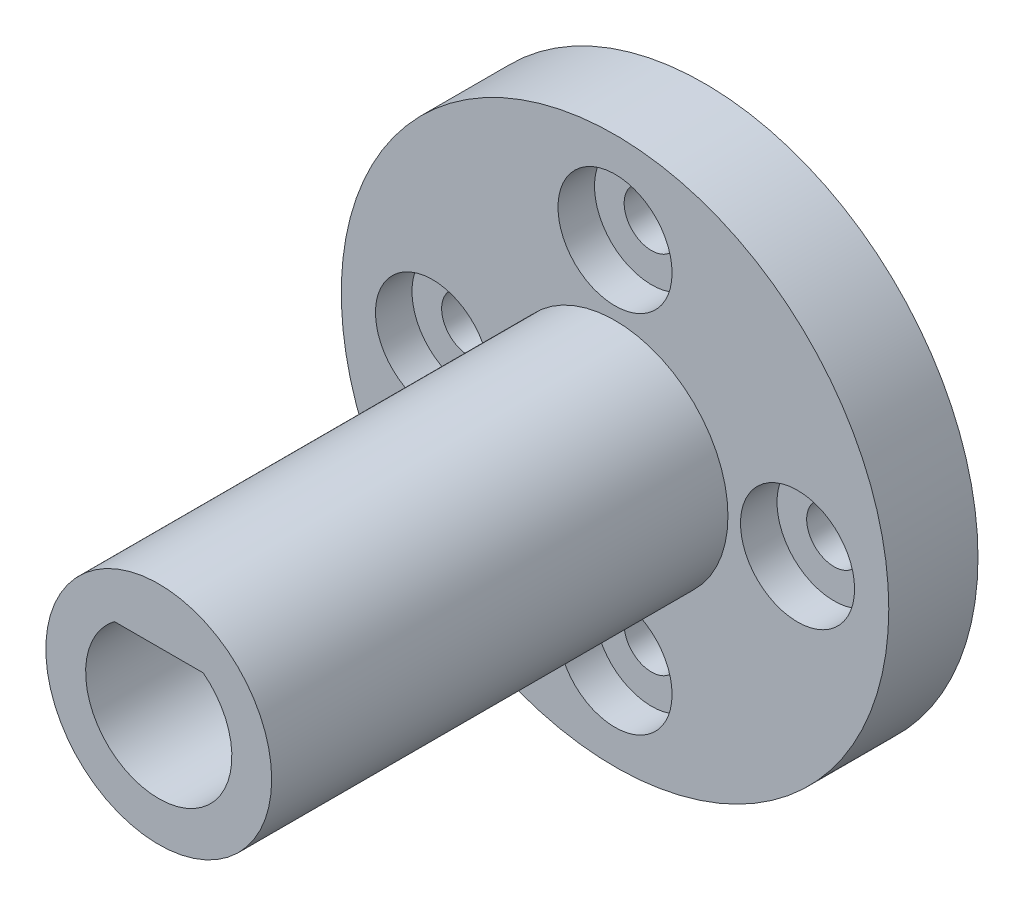
ISO-10303-21;
HEADER;
FILE_DESCRIPTION(('STEP AP214'),'2;1');
FILE_NAME('part.step','',(''),(''),'','','');
FILE_SCHEMA(('AUTOMOTIVE_DESIGN { 1 0 10303 214 1 1 1 1 }'));
ENDSEC;
DATA;
#1=APPLICATION_CONTEXT('core data for automotive mechanical design processes');
#2=APPLICATION_PROTOCOL_DEFINITION('international standard','automotive_design',2000,#1);
#3=PRODUCT_CONTEXT('',#1,'mechanical');
#4=PRODUCT('Part','Part','',(#3));
#5=PRODUCT_RELATED_PRODUCT_CATEGORY('part','',(#4));
#6=PRODUCT_DEFINITION_FORMATION('','',#4);
#7=PRODUCT_DEFINITION_CONTEXT('part definition',#1,'design');
#8=PRODUCT_DEFINITION('design','',#6,#7);
#9=PRODUCT_DEFINITION_SHAPE('','',#8);
#10=(LENGTH_UNIT() NAMED_UNIT(*) SI_UNIT(.MILLI.,.METRE.));
#11=(NAMED_UNIT(*) PLANE_ANGLE_UNIT() SI_UNIT($,.RADIAN.));
#12=(NAMED_UNIT(*) SI_UNIT($,.STERADIAN.) SOLID_ANGLE_UNIT());
#13=UNCERTAINTY_MEASURE_WITH_UNIT(LENGTH_MEASURE(1.E-05),#10,'distance_accuracy_value','');
#14=(GEOMETRIC_REPRESENTATION_CONTEXT(3) GLOBAL_UNCERTAINTY_ASSIGNED_CONTEXT((#13)) GLOBAL_UNIT_ASSIGNED_CONTEXT((#10,
#11,#12)) REPRESENTATION_CONTEXT('',''));
#15=CARTESIAN_POINT('',(0.,0.,0.));
#16=DIRECTION('',(0.,0.,1.));
#17=DIRECTION('',(1.,0.,0.));
#18=AXIS2_PLACEMENT_3D('',#15,#16,#17);
#19=CARTESIAN_POINT('',(0.,0.,3.91));
#20=DIRECTION('',(0.,0.,-1.));
#21=DIRECTION('',(-1.,0.,0.));
#22=AXIS2_PLACEMENT_3D('',#19,#20,#21);
#23=CYLINDRICAL_SURFACE('',#22,12.);
#24=CARTESIAN_POINT('',(0.,0.,3.91));
#25=DIRECTION('',(0.,0.,1.));
#26=DIRECTION('',(1.,0.,0.));
#27=AXIS2_PLACEMENT_3D('',#24,#25,#26);
#28=CIRCLE('',#27,12.);
#29=CARTESIAN_POINT('',(12.,0.,3.91));
#30=VERTEX_POINT('',#29);
#31=EDGE_CURVE('E11',#30,#30,#28,.T.);
#32=ORIENTED_EDGE('',*,*,#31,.F.);
#33=EDGE_LOOP('',(#32));
#34=FACE_BOUND('',#33,.T.);
#35=CARTESIAN_POINT('',(0.,0.,0.));
#36=DIRECTION('',(0.,0.,1.));
#37=DIRECTION('',(1.,0.,0.));
#38=AXIS2_PLACEMENT_3D('',#35,#36,#37);
#39=CIRCLE('',#38,12.);
#40=CARTESIAN_POINT('',(12.,0.,0.));
#41=VERTEX_POINT('',#40);
#42=EDGE_CURVE('E40',#41,#41,#39,.T.);
#43=ORIENTED_EDGE('',*,*,#42,.T.);
#44=EDGE_LOOP('',(#43));
#45=FACE_BOUND('',#44,.T.);
#46=ADVANCED_FACE('F37',(#34,#45),#23,.T.);
#47=CARTESIAN_POINT('',(0.,0.,3.91));
#48=DIRECTION('',(0.,0.,1.));
#49=DIRECTION('',(1.,0.,0.));
#50=AXIS2_PLACEMENT_3D('',#47,#48,#49);
#51=PLANE('',#50);
#52=CARTESIAN_POINT('',(8.,0.,3.91));
#53=DIRECTION('',(0.,0.,1.));
#54=DIRECTION('',(1.,0.,0.));
#55=AXIS2_PLACEMENT_3D('',#52,#53,#54);
#56=CIRCLE('',#55,2.5);
#57=CARTESIAN_POINT('',(10.5,0.,3.91));
#58=VERTEX_POINT('',#57);
#59=EDGE_CURVE('E307',#58,#58,#56,.T.);
#60=ORIENTED_EDGE('',*,*,#59,.F.);
#61=EDGE_LOOP('',(#60));
#62=FACE_BOUND('',#61,.T.);
#63=CARTESIAN_POINT('',(0.,-8.,3.91));
#64=DIRECTION('',(0.,0.,1.));
#65=DIRECTION('',(1.,0.,0.));
#66=AXIS2_PLACEMENT_3D('',#63,#64,#65);
#67=CIRCLE('',#66,2.5);
#68=CARTESIAN_POINT('',(2.5,-8.,3.91));
#69=VERTEX_POINT('',#68);
#70=EDGE_CURVE('E317',#69,#69,#67,.T.);
#71=ORIENTED_EDGE('',*,*,#70,.F.);
#72=EDGE_LOOP('',(#71));
#73=FACE_BOUND('',#72,.T.);
#74=CARTESIAN_POINT('',(-8.,0.,3.91));
#75=DIRECTION('',(0.,0.,1.));
#76=DIRECTION('',(1.,0.,0.));
#77=AXIS2_PLACEMENT_3D('',#74,#75,#76);
#78=CIRCLE('',#77,2.5);
#79=CARTESIAN_POINT('',(-5.50000000000001,0.,3.91));
#80=VERTEX_POINT('',#79);
#81=EDGE_CURVE('E329',#80,#80,#78,.T.);
#82=ORIENTED_EDGE('',*,*,#81,.F.);
#83=EDGE_LOOP('',(#82));
#84=FACE_BOUND('',#83,.T.);
#85=CARTESIAN_POINT('',(0.,8.,3.91));
#86=DIRECTION('',(0.,0.,1.));
#87=DIRECTION('',(1.,0.,0.));
#88=AXIS2_PLACEMENT_3D('',#85,#86,#87);
#89=CIRCLE('',#88,2.5);
#90=CARTESIAN_POINT('',(2.5,8.,3.91));
#91=VERTEX_POINT('',#90);
#92=EDGE_CURVE('E341',#91,#91,#89,.T.);
#93=ORIENTED_EDGE('',*,*,#92,.F.);
#94=EDGE_LOOP('',(#93));
#95=FACE_BOUND('',#94,.T.);
#96=CARTESIAN_POINT('',(0.,0.,3.91));
#97=DIRECTION('',(0.,0.,1.));
#98=DIRECTION('',(1.,0.,0.));
#99=AXIS2_PLACEMENT_3D('',#96,#97,#98);
#100=CIRCLE('',#99,4.95);
#101=CARTESIAN_POINT('',(4.95,0.,3.91));
#102=VERTEX_POINT('',#101);
#103=EDGE_CURVE('E77',#102,#102,#100,.T.);
#104=ORIENTED_EDGE('',*,*,#103,.F.);
#105=EDGE_LOOP('',(#104));
#106=FACE_BOUND('',#105,.T.);
#107=ORIENTED_EDGE('',*,*,#31,.T.);
#108=EDGE_LOOP('',(#107));
#109=FACE_BOUND('',#108,.T.);
#110=ADVANCED_FACE('F96',(#62,#73,#84,#95,#106,#109),#51,.T.);
#111=CARTESIAN_POINT('',(0.,0.,0.));
#112=DIRECTION('',(0.,0.,1.));
#113=DIRECTION('',(1.,0.,0.));
#114=AXIS2_PLACEMENT_3D('',#111,#112,#113);
#115=PLANE('',#114);
#116=CARTESIAN_POINT('',(8.,0.,0.));
#117=DIRECTION('',(0.,0.,1.));
#118=DIRECTION('',(1.,0.,0.));
#119=AXIS2_PLACEMENT_3D('',#116,#117,#118);
#120=CIRCLE('',#119,1.2);
#121=CARTESIAN_POINT('',(9.2,0.,0.));
#122=VERTEX_POINT('',#121);
#123=EDGE_CURVE('E314',#122,#122,#120,.T.);
#124=ORIENTED_EDGE('',*,*,#123,.T.);
#125=EDGE_LOOP('',(#124));
#126=FACE_BOUND('',#125,.T.);
#127=CARTESIAN_POINT('',(0.,-8.,0.));
#128=DIRECTION('',(0.,0.,1.));
#129=DIRECTION('',(1.,0.,0.));
#130=AXIS2_PLACEMENT_3D('',#127,#128,#129);
#131=CIRCLE('',#130,1.2);
#132=CARTESIAN_POINT('',(1.2,-8.,0.));
#133=VERTEX_POINT('',#132);
#134=EDGE_CURVE('E326',#133,#133,#131,.T.);
#135=ORIENTED_EDGE('',*,*,#134,.T.);
#136=EDGE_LOOP('',(#135));
#137=FACE_BOUND('',#136,.T.);
#138=CARTESIAN_POINT('',(-8.,0.,0.));
#139=DIRECTION('',(0.,0.,1.));
#140=DIRECTION('',(1.,0.,0.));
#141=AXIS2_PLACEMENT_3D('',#138,#139,#140);
#142=CIRCLE('',#141,1.2);
#143=CARTESIAN_POINT('',(-6.8,0.,0.));
#144=VERTEX_POINT('',#143);
#145=EDGE_CURVE('E338',#144,#144,#142,.T.);
#146=ORIENTED_EDGE('',*,*,#145,.T.);
#147=EDGE_LOOP('',(#146));
#148=FACE_BOUND('',#147,.T.);
#149=CARTESIAN_POINT('',(0.,8.,0.));
#150=DIRECTION('',(0.,0.,1.));
#151=DIRECTION('',(1.,0.,0.));
#152=AXIS2_PLACEMENT_3D('',#149,#150,#151);
#153=CIRCLE('',#152,1.2);
#154=CARTESIAN_POINT('',(1.2,8.,0.));
#155=VERTEX_POINT('',#154);
#156=EDGE_CURVE('E67',#155,#155,#153,.T.);
#157=ORIENTED_EDGE('',*,*,#156,.T.);
#158=EDGE_LOOP('',(#157));
#159=FACE_BOUND('',#158,.T.);
#160=CARTESIAN_POINT('',(0.,0.,0.));
#161=DIRECTION('',(0.,0.,-1.));
#162=DIRECTION('',(-1.,0.,0.));
#163=AXIS2_PLACEMENT_3D('',#160,#161,#162);
#164=CIRCLE('',#163,4.);
#165=CARTESIAN_POINT('',(-4.,0.,0.));
#166=VERTEX_POINT('',#165);
#167=EDGE_CURVE('E84',#166,#166,#164,.T.);
#168=ORIENTED_EDGE('',*,*,#167,.F.);
#169=EDGE_LOOP('',(#168));
#170=FACE_BOUND('',#169,.T.);
#171=ORIENTED_EDGE('',*,*,#42,.F.);
#172=EDGE_LOOP('',(#171));
#173=FACE_BOUND('',#172,.T.);
#174=ADVANCED_FACE('F93',(#126,#137,#148,#159,#170,#173),#115,.F.);
#175=CARTESIAN_POINT('',(0.,0.,1.91));
#176=DIRECTION('',(0.,0.,-1.));
#177=DIRECTION('',(-1.,0.,0.));
#178=AXIS2_PLACEMENT_3D('',#175,#176,#177);
#179=CYLINDRICAL_SURFACE('',#178,4.);
#180=CARTESIAN_POINT('',(0.,0.,1.91));
#181=DIRECTION('',(0.,0.,-1.));
#182=DIRECTION('',(-1.,0.,0.));
#183=AXIS2_PLACEMENT_3D('',#180,#181,#182);
#184=CIRCLE('',#183,4.);
#185=CARTESIAN_POINT('',(-4.,0.,1.91));
#186=VERTEX_POINT('',#185);
#187=EDGE_CURVE('E85',#186,#186,#184,.T.);
#188=CARTESIAN_POINT('',(-4.,0.,1.91));
#189=CARTESIAN_POINT('',(-4.,0.,1.89010416666667));
#190=CARTESIAN_POINT('',(-4.,0.,1.87020833333333));
#191=CARTESIAN_POINT('',(-4.,0.,1.83041666666667));
#192=CARTESIAN_POINT('',(-4.,0.,1.81052083333333));
#193=CARTESIAN_POINT('',(-4.,0.,1.77072916666667));
#194=CARTESIAN_POINT('',(-4.,0.,1.75083333333333));
#195=CARTESIAN_POINT('',(-4.,0.,1.71104166666667));
#196=CARTESIAN_POINT('',(-4.,0.,1.69114583333333));
#197=CARTESIAN_POINT('',(-4.,0.,1.65135416666667));
#198=CARTESIAN_POINT('',(-4.,0.,1.63145833333333));
#199=CARTESIAN_POINT('',(-4.,0.,1.59166666666667));
#200=CARTESIAN_POINT('',(-4.,0.,1.57177083333333));
#201=CARTESIAN_POINT('',(-4.,0.,1.53197916666667));
#202=CARTESIAN_POINT('',(-4.,0.,1.51208333333333));
#203=CARTESIAN_POINT('',(-4.,0.,1.47229166666667));
#204=CARTESIAN_POINT('',(-4.,0.,1.45239583333333));
#205=CARTESIAN_POINT('',(-4.,0.,1.41260416666667));
#206=CARTESIAN_POINT('',(-4.,0.,1.39270833333333));
#207=CARTESIAN_POINT('',(-4.,0.,1.35291666666667));
#208=CARTESIAN_POINT('',(-4.,0.,1.33302083333333));
#209=CARTESIAN_POINT('',(-4.,0.,1.29322916666667));
#210=CARTESIAN_POINT('',(-4.,0.,1.27333333333333));
#211=CARTESIAN_POINT('',(-4.,0.,1.23354166666667));
#212=CARTESIAN_POINT('',(-4.,0.,1.21364583333333));
#213=CARTESIAN_POINT('',(-4.,0.,1.17385416666667));
#214=CARTESIAN_POINT('',(-4.,0.,1.15395833333333));
#215=CARTESIAN_POINT('',(-4.,0.,1.11416666666667));
#216=CARTESIAN_POINT('',(-4.,0.,1.09427083333333));
#217=CARTESIAN_POINT('',(-4.,0.,1.05447916666667));
#218=CARTESIAN_POINT('',(-4.,0.,1.03458333333333));
#219=CARTESIAN_POINT('',(-4.,0.,0.994791666666667));
#220=CARTESIAN_POINT('',(-4.,0.,0.974895833333334));
#221=CARTESIAN_POINT('',(-4.,0.,0.935104166666667));
#222=CARTESIAN_POINT('',(-4.,0.,0.915208333333333));
#223=CARTESIAN_POINT('',(-4.,0.,0.875416666666667));
#224=CARTESIAN_POINT('',(-4.,0.,0.855520833333333));
#225=CARTESIAN_POINT('',(-4.,0.,0.815729166666667));
#226=CARTESIAN_POINT('',(-4.,0.,0.795833333333333));
#227=CARTESIAN_POINT('',(-4.,0.,0.756041666666667));
#228=CARTESIAN_POINT('',(-4.,0.,0.736145833333333));
#229=CARTESIAN_POINT('',(-4.,0.,0.696354166666667));
#230=CARTESIAN_POINT('',(-4.,0.,0.676458333333333));
#231=CARTESIAN_POINT('',(-4.,0.,0.636666666666667));
#232=CARTESIAN_POINT('',(-4.,0.,0.616770833333333));
#233=CARTESIAN_POINT('',(-4.,0.,0.576979166666667));
#234=CARTESIAN_POINT('',(-4.,0.,0.557083333333333));
#235=CARTESIAN_POINT('',(-4.,0.,0.517291666666667));
#236=CARTESIAN_POINT('',(-4.,0.,0.497395833333333));
#237=CARTESIAN_POINT('',(-4.,0.,0.457604166666667));
#238=CARTESIAN_POINT('',(-4.,0.,0.437708333333333));
#239=CARTESIAN_POINT('',(-4.,0.,0.397916666666667));
#240=CARTESIAN_POINT('',(-4.,0.,0.378020833333333));
#241=CARTESIAN_POINT('',(-4.,0.,0.338229166666667));
#242=CARTESIAN_POINT('',(-4.,0.,0.318333333333333));
#243=CARTESIAN_POINT('',(-4.,0.,0.278541666666667));
#244=CARTESIAN_POINT('',(-4.,0.,0.258645833333333));
#245=CARTESIAN_POINT('',(-4.,0.,0.218854166666667));
#246=CARTESIAN_POINT('',(-4.,0.,0.198958333333333));
#247=CARTESIAN_POINT('',(-4.,0.,0.159166666666667));
#248=CARTESIAN_POINT('',(-4.,0.,0.139270833333333));
#249=CARTESIAN_POINT('',(-4.,0.,0.0994791666666668));
#250=CARTESIAN_POINT('',(-4.,0.,0.0795833333333334));
#251=CARTESIAN_POINT('',(-4.,0.,0.0397916666666667));
#252=CARTESIAN_POINT('',(-4.,0.,0.0198958333333334));
#253=CARTESIAN_POINT('',(-4.,0.,0.));
#254=B_SPLINE_CURVE_WITH_KNOTS('',3,(#188,#189,#190,#191,#192,#193,#194,#195,#196,#197,#198,
#199,#200,#201,#202,#203,#204,#205,#206,#207,#208,#209,#210,#211,#212,#213,#214,#215,#216,#217,
#218,#219,#220,#221,#222,#223,#224,#225,#226,#227,#228,#229,#230,#231,#232,#233,#234,#235,#236,
#237,#238,#239,#240,#241,#242,#243,#244,#245,#246,#247,#248,#249,#250,#251,#252,#253),
.UNSPECIFIED.,.F.,.F.,(4,2,2,2,2,2,2,2,2,2,2,2,2,2,2,2,2,2,2,2,2,2,2,2,2,2,2,2,2,2,2,2,4),(0.,
0.0596874999999998,0.119375,0.1790625,0.23875,0.2984375,0.358125,0.4178125,0.4775,0.5371875,
0.596875,0.6565625,0.71625,0.7759375,0.835625,0.8953125,0.955,1.0146875,1.074375,1.1340625,
1.19375,1.2534375,1.313125,1.3728125,1.4325,1.4921875,1.551875,1.6115625,1.67125,1.7309375,
1.790625,1.8503125,1.91),.UNSPECIFIED.);
#255=EDGE_CURVE('BSEAM91',#186,#166,#254,.T.);
#256=ORIENTED_EDGE('',*,*,#187,.F.);
#257=ORIENTED_EDGE('',*,*,#167,.T.);
#258=ORIENTED_EDGE('',*,*,#255,.T.);
#259=ORIENTED_EDGE('',*,*,#255,.F.);
#260=EDGE_LOOP('',(#256,#258,#257,#259));
#261=FACE_BOUND('',#260,.T.);
#262=ADVANCED_FACE('F91',(#261),#179,.F.);
#263=CARTESIAN_POINT('',(0.,0.,1.91));
#264=DIRECTION('',(0.,0.,-1.));
#265=DIRECTION('',(-1.,0.,0.));
#266=AXIS2_PLACEMENT_3D('',#263,#264,#265);
#267=PLANE('',#266);
#268=ORIENTED_EDGE('',*,*,#187,.T.);
#269=EDGE_LOOP('',(#268));
#270=FACE_BOUND('',#269,.T.);
#271=ADVANCED_FACE('F140',(#270),#267,.T.);
#272=CARTESIAN_POINT('',(0.,2.545,23.91));
#273=DIRECTION('',(0.,-1.,0.));
#274=DIRECTION('',(0.,0.,-1.));
#275=AXIS2_PLACEMENT_3D('',#272,#273,#274);
#276=PLANE('',#275);
#277=DIRECTION('',(-1.,0.,0.));
#278=VECTOR('',#277,1.);
#279=CARTESIAN_POINT('',(0.,2.545,3.91));
#280=LINE('',#279,#278);
#281=CARTESIAN_POINT('',(1.94807597387782,2.545,3.91));
#282=VERTEX_POINT('',#281);
#283=CARTESIAN_POINT('',(-1.94807597387782,2.545,3.91));
#284=VERTEX_POINT('',#283);
#285=EDGE_CURVE('E64',#282,#284,#280,.T.);
#286=ORIENTED_EDGE('',*,*,#285,.F.);
#287=DIRECTION('',(0.,0.,-1.));
#288=VECTOR('',#287,1.);
#289=CARTESIAN_POINT('',(1.94807597387782,2.545,23.91));
#290=LINE('',#289,#288);
#291=CARTESIAN_POINT('',(1.94807597387782,2.545,23.91));
#292=VERTEX_POINT('',#291);
#293=EDGE_CURVE('E73',#292,#282,#290,.T.);
#294=ORIENTED_EDGE('',*,*,#293,.F.);
#295=DIRECTION('',(-1.,0.,0.));
#296=VECTOR('',#295,1.);
#297=CARTESIAN_POINT('',(0.,2.545,23.91));
#298=LINE('',#297,#296);
#299=CARTESIAN_POINT('',(-1.94807597387782,2.545,23.91));
#300=VERTEX_POINT('',#299);
#301=EDGE_CURVE('E71',#292,#300,#298,.T.);
#302=ORIENTED_EDGE('',*,*,#301,.T.);
#303=DIRECTION('',(0.,0.,-1.));
#304=VECTOR('',#303,1.);
#305=CARTESIAN_POINT('',(-1.94807597387782,2.545,23.91));
#306=LINE('',#305,#304);
#307=EDGE_CURVE('E58',#300,#284,#306,.T.);
#308=ORIENTED_EDGE('',*,*,#307,.T.);
#309=EDGE_LOOP('',(#286,#294,#302,#308));
#310=FACE_BOUND('',#309,.T.);
#311=ADVANCED_FACE('F69',(#310),#276,.T.);
#312=CARTESIAN_POINT('',(0.,0.,23.91));
#313=DIRECTION('',(0.,0.,-1.));
#314=DIRECTION('',(-1.,0.,0.));
#315=AXIS2_PLACEMENT_3D('',#312,#313,#314);
#316=CYLINDRICAL_SURFACE('',#315,3.205);
#317=CARTESIAN_POINT('',(0.,0.,3.91));
#318=DIRECTION('',(0.,0.,1.));
#319=DIRECTION('',(1.,0.,0.));
#320=AXIS2_PLACEMENT_3D('',#317,#318,#319);
#321=CIRCLE('',#320,3.205);
#322=EDGE_CURVE('E50',#284,#282,#321,.T.);
#323=ORIENTED_EDGE('',*,*,#322,.F.);
#324=ORIENTED_EDGE('',*,*,#307,.F.);
#325=CARTESIAN_POINT('',(0.,0.,23.91));
#326=DIRECTION('',(0.,0.,1.));
#327=DIRECTION('',(1.,0.,0.));
#328=AXIS2_PLACEMENT_3D('',#325,#326,#327);
#329=CIRCLE('',#328,3.205);
#330=EDGE_CURVE('E353',#300,#292,#329,.T.);
#331=ORIENTED_EDGE('',*,*,#330,.T.);
#332=ORIENTED_EDGE('',*,*,#293,.T.);
#333=EDGE_LOOP('',(#323,#324,#331,#332));
#334=FACE_BOUND('',#333,.T.);
#335=ADVANCED_FACE('F76',(#334),#316,.F.);
#336=CARTESIAN_POINT('',(0.,0.,23.91));
#337=DIRECTION('',(0.,0.,-1.));
#338=DIRECTION('',(-1.,0.,0.));
#339=AXIS2_PLACEMENT_3D('',#336,#337,#338);
#340=CYLINDRICAL_SURFACE('',#339,4.95);
#341=CARTESIAN_POINT('',(0.,0.,23.91));
#342=DIRECTION('',(0.,0.,1.));
#343=DIRECTION('',(1.,0.,0.));
#344=AXIS2_PLACEMENT_3D('',#341,#342,#343);
#345=CIRCLE('',#344,4.95);
#346=CARTESIAN_POINT('',(4.95,0.,23.91));
#347=VERTEX_POINT('',#346);
#348=EDGE_CURVE('E74',#347,#347,#345,.T.);
#349=ORIENTED_EDGE('',*,*,#348,.F.);
#350=EDGE_LOOP('',(#349));
#351=FACE_BOUND('',#350,.T.);
#352=ORIENTED_EDGE('',*,*,#103,.T.);
#353=EDGE_LOOP('',(#352));
#354=FACE_BOUND('',#353,.T.);
#355=ADVANCED_FACE('F125',(#351,#354),#340,.T.);
#356=CARTESIAN_POINT('',(0.,0.,23.91));
#357=DIRECTION('',(0.,0.,1.));
#358=DIRECTION('',(1.,0.,0.));
#359=AXIS2_PLACEMENT_3D('',#356,#357,#358);
#360=PLANE('',#359);
#361=ORIENTED_EDGE('',*,*,#301,.F.);
#362=ORIENTED_EDGE('',*,*,#330,.F.);
#363=EDGE_LOOP('',(#361,#362));
#364=FACE_BOUND('',#363,.T.);
#365=ORIENTED_EDGE('',*,*,#348,.T.);
#366=EDGE_LOOP('',(#365));
#367=FACE_BOUND('',#366,.T.);
#368=ADVANCED_FACE('F117',(#364,#367),#360,.T.);
#369=ORIENTED_EDGE('',*,*,#285,.T.);
#370=ORIENTED_EDGE('',*,*,#322,.T.);
#371=EDGE_LOOP('',(#369,#370));
#372=FACE_BOUND('',#371,.T.);
#373=ADVANCED_FACE('F65',(#372),#51,.T.);
#374=CARTESIAN_POINT('',(0.,8.,3.91));
#375=DIRECTION('',(0.,0.,1.));
#376=DIRECTION('',(1.,0.,0.));
#377=AXIS2_PLACEMENT_3D('',#374,#375,#376);
#378=CYLINDRICAL_SURFACE('',#377,1.2);
#379=ORIENTED_EDGE('',*,*,#156,.F.);
#380=EDGE_LOOP('',(#379));
#381=FACE_BOUND('',#380,.T.);
#382=CARTESIAN_POINT('',(0.,8.,2.31));
#383=DIRECTION('',(0.,0.,1.));
#384=DIRECTION('',(1.,0.,0.));
#385=AXIS2_PLACEMENT_3D('',#382,#383,#384);
#386=CIRCLE('',#385,1.2);
#387=CARTESIAN_POINT('',(1.2,8.,2.31));
#388=VERTEX_POINT('',#387);
#389=EDGE_CURVE('E347',#388,#388,#386,.T.);
#390=ORIENTED_EDGE('',*,*,#389,.T.);
#391=EDGE_LOOP('',(#390));
#392=FACE_BOUND('',#391,.T.);
#393=ADVANCED_FACE('F116',(#381,#392),#378,.F.);
#394=CARTESIAN_POINT('',(1.2,8.,2.31));
#395=DIRECTION('',(0.,0.,-1.));
#396=DIRECTION('',(-1.,0.,0.));
#397=AXIS2_PLACEMENT_3D('',#394,#395,#396);
#398=PLANE('',#397);
#399=ORIENTED_EDGE('',*,*,#389,.F.);
#400=EDGE_LOOP('',(#399));
#401=FACE_BOUND('',#400,.T.);
#402=CARTESIAN_POINT('',(0.,8.,2.31));
#403=DIRECTION('',(0.,0.,1.));
#404=DIRECTION('',(1.,0.,0.));
#405=AXIS2_PLACEMENT_3D('',#402,#403,#404);
#406=CIRCLE('',#405,2.5);
#407=CARTESIAN_POINT('',(2.5,8.,2.31));
#408=VERTEX_POINT('',#407);
#409=EDGE_CURVE('E344',#408,#408,#406,.T.);
#410=ORIENTED_EDGE('',*,*,#409,.T.);
#411=EDGE_LOOP('',(#410));
#412=FACE_BOUND('',#411,.T.);
#413=ADVANCED_FACE('F122',(#401,#412),#398,.F.);
#414=CARTESIAN_POINT('',(0.,8.,3.91));
#415=DIRECTION('',(0.,0.,1.));
#416=DIRECTION('',(1.,0.,0.));
#417=AXIS2_PLACEMENT_3D('',#414,#415,#416);
#418=CYLINDRICAL_SURFACE('',#417,2.5);
#419=ORIENTED_EDGE('',*,*,#409,.F.);
#420=EDGE_LOOP('',(#419));
#421=FACE_BOUND('',#420,.T.);
#422=ORIENTED_EDGE('',*,*,#92,.T.);
#423=EDGE_LOOP('',(#422));
#424=FACE_BOUND('',#423,.T.);
#425=ADVANCED_FACE('F190',(#421,#424),#418,.F.);
#426=CARTESIAN_POINT('',(-8.,0.,3.91));
#427=DIRECTION('',(0.,0.,1.));
#428=DIRECTION('',(1.,0.,0.));
#429=AXIS2_PLACEMENT_3D('',#426,#427,#428);
#430=CYLINDRICAL_SURFACE('',#429,1.2);
#431=ORIENTED_EDGE('',*,*,#145,.F.);
#432=EDGE_LOOP('',(#431));
#433=FACE_BOUND('',#432,.T.);
#434=CARTESIAN_POINT('',(-8.,0.,2.31));
#435=DIRECTION('',(0.,0.,1.));
#436=DIRECTION('',(1.,0.,0.));
#437=AXIS2_PLACEMENT_3D('',#434,#435,#436);
#438=CIRCLE('',#437,1.2);
#439=CARTESIAN_POINT('',(-6.8,0.,2.31));
#440=VERTEX_POINT('',#439);
#441=EDGE_CURVE('E335',#440,#440,#438,.T.);
#442=ORIENTED_EDGE('',*,*,#441,.T.);
#443=EDGE_LOOP('',(#442));
#444=FACE_BOUND('',#443,.T.);
#445=ADVANCED_FACE('F198',(#433,#444),#430,.F.);
#446=CARTESIAN_POINT('',(-6.8,0.,2.31));
#447=DIRECTION('',(0.,0.,-1.));
#448=DIRECTION('',(-1.,0.,0.));
#449=AXIS2_PLACEMENT_3D('',#446,#447,#448);
#450=PLANE('',#449);
#451=ORIENTED_EDGE('',*,*,#441,.F.);
#452=EDGE_LOOP('',(#451));
#453=FACE_BOUND('',#452,.T.);
#454=CARTESIAN_POINT('',(-8.,0.,2.31));
#455=DIRECTION('',(0.,0.,1.));
#456=DIRECTION('',(1.,0.,0.));
#457=AXIS2_PLACEMENT_3D('',#454,#455,#456);
#458=CIRCLE('',#457,2.5);
#459=CARTESIAN_POINT('',(-5.5,0.,2.31));
#460=VERTEX_POINT('',#459);
#461=EDGE_CURVE('E332',#460,#460,#458,.T.);
#462=ORIENTED_EDGE('',*,*,#461,.T.);
#463=EDGE_LOOP('',(#462));
#464=FACE_BOUND('',#463,.T.);
#465=ADVANCED_FACE('F218',(#453,#464),#450,.F.);
#466=CARTESIAN_POINT('',(-8.,0.,3.91));
#467=DIRECTION('',(0.,0.,1.));
#468=DIRECTION('',(1.,0.,0.));
#469=AXIS2_PLACEMENT_3D('',#466,#467,#468);
#470=CYLINDRICAL_SURFACE('',#469,2.5);
#471=ORIENTED_EDGE('',*,*,#461,.F.);
#472=EDGE_LOOP('',(#471));
#473=FACE_BOUND('',#472,.T.);
#474=ORIENTED_EDGE('',*,*,#81,.T.);
#475=EDGE_LOOP('',(#474));
#476=FACE_BOUND('',#475,.T.);
#477=ADVANCED_FACE('F228',(#473,#476),#470,.F.);
#478=CARTESIAN_POINT('',(0.,-8.,3.91));
#479=DIRECTION('',(0.,0.,1.));
#480=DIRECTION('',(1.,0.,0.));
#481=AXIS2_PLACEMENT_3D('',#478,#479,#480);
#482=CYLINDRICAL_SURFACE('',#481,1.2);
#483=ORIENTED_EDGE('',*,*,#134,.F.);
#484=EDGE_LOOP('',(#483));
#485=FACE_BOUND('',#484,.T.);
#486=CARTESIAN_POINT('',(0.,-8.,2.31));
#487=DIRECTION('',(0.,0.,1.));
#488=DIRECTION('',(1.,0.,0.));
#489=AXIS2_PLACEMENT_3D('',#486,#487,#488);
#490=CIRCLE('',#489,1.2);
#491=CARTESIAN_POINT('',(1.2,-8.,2.31));
#492=VERTEX_POINT('',#491);
#493=EDGE_CURVE('E323',#492,#492,#490,.T.);
#494=ORIENTED_EDGE('',*,*,#493,.T.);
#495=EDGE_LOOP('',(#494));
#496=FACE_BOUND('',#495,.T.);
#497=ADVANCED_FACE('F238',(#485,#496),#482,.F.);
#498=CARTESIAN_POINT('',(1.2,-8.,2.31));
#499=DIRECTION('',(0.,0.,-1.));
#500=DIRECTION('',(-1.,0.,0.));
#501=AXIS2_PLACEMENT_3D('',#498,#499,#500);
#502=PLANE('',#501);
#503=ORIENTED_EDGE('',*,*,#493,.F.);
#504=EDGE_LOOP('',(#503));
#505=FACE_BOUND('',#504,.T.);
#506=CARTESIAN_POINT('',(0.,-8.,2.31));
#507=DIRECTION('',(0.,0.,1.));
#508=DIRECTION('',(1.,0.,0.));
#509=AXIS2_PLACEMENT_3D('',#506,#507,#508);
#510=CIRCLE('',#509,2.5);
#511=CARTESIAN_POINT('',(2.5,-8.,2.31));
#512=VERTEX_POINT('',#511);
#513=EDGE_CURVE('E320',#512,#512,#510,.T.);
#514=ORIENTED_EDGE('',*,*,#513,.T.);
#515=EDGE_LOOP('',(#514));
#516=FACE_BOUND('',#515,.T.);
#517=ADVANCED_FACE('F248',(#505,#516),#502,.F.);
#518=CARTESIAN_POINT('',(0.,-8.,3.91));
#519=DIRECTION('',(0.,0.,1.));
#520=DIRECTION('',(1.,0.,0.));
#521=AXIS2_PLACEMENT_3D('',#518,#519,#520);
#522=CYLINDRICAL_SURFACE('',#521,2.5);
#523=ORIENTED_EDGE('',*,*,#513,.F.);
#524=EDGE_LOOP('',(#523));
#525=FACE_BOUND('',#524,.T.);
#526=ORIENTED_EDGE('',*,*,#70,.T.);
#527=EDGE_LOOP('',(#526));
#528=FACE_BOUND('',#527,.T.);
#529=ADVANCED_FACE('F258',(#525,#528),#522,.F.);
#530=CARTESIAN_POINT('',(8.,0.,3.91));
#531=DIRECTION('',(0.,0.,1.));
#532=DIRECTION('',(1.,0.,0.));
#533=AXIS2_PLACEMENT_3D('',#530,#531,#532);
#534=CYLINDRICAL_SURFACE('',#533,1.2);
#535=ORIENTED_EDGE('',*,*,#123,.F.);
#536=EDGE_LOOP('',(#535));
#537=FACE_BOUND('',#536,.T.);
#538=CARTESIAN_POINT('',(8.,0.,2.31));
#539=DIRECTION('',(0.,0.,1.));
#540=DIRECTION('',(1.,0.,0.));
#541=AXIS2_PLACEMENT_3D('',#538,#539,#540);
#542=CIRCLE('',#541,1.2);
#543=CARTESIAN_POINT('',(9.2,0.,2.31));
#544=VERTEX_POINT('',#543);
#545=EDGE_CURVE('E309',#544,#544,#542,.T.);
#546=ORIENTED_EDGE('',*,*,#545,.T.);
#547=EDGE_LOOP('',(#546));
#548=FACE_BOUND('',#547,.T.);
#549=ADVANCED_FACE('F268',(#537,#548),#534,.F.);
#550=CARTESIAN_POINT('',(9.2,0.,2.31));
#551=DIRECTION('',(0.,0.,-1.));
#552=DIRECTION('',(-1.,0.,0.));
#553=AXIS2_PLACEMENT_3D('',#550,#551,#552);
#554=PLANE('',#553);
#555=ORIENTED_EDGE('',*,*,#545,.F.);
#556=EDGE_LOOP('',(#555));
#557=FACE_BOUND('',#556,.T.);
#558=CARTESIAN_POINT('',(8.,0.,2.31));
#559=DIRECTION('',(0.,0.,1.));
#560=DIRECTION('',(1.,0.,0.));
#561=AXIS2_PLACEMENT_3D('',#558,#559,#560);
#562=CIRCLE('',#561,2.5);
#563=CARTESIAN_POINT('',(10.5,0.,2.31));
#564=VERTEX_POINT('',#563);
#565=EDGE_CURVE('E305',#564,#564,#562,.T.);
#566=ORIENTED_EDGE('',*,*,#565,.T.);
#567=EDGE_LOOP('',(#566));
#568=FACE_BOUND('',#567,.T.);
#569=ADVANCED_FACE('F278',(#557,#568),#554,.F.);
#570=CARTESIAN_POINT('',(8.,0.,3.91));
#571=DIRECTION('',(0.,0.,1.));
#572=DIRECTION('',(1.,0.,0.));
#573=AXIS2_PLACEMENT_3D('',#570,#571,#572);
#574=CYLINDRICAL_SURFACE('',#573,2.5);
#575=ORIENTED_EDGE('',*,*,#565,.F.);
#576=EDGE_LOOP('',(#575));
#577=FACE_BOUND('',#576,.T.);
#578=ORIENTED_EDGE('',*,*,#59,.T.);
#579=EDGE_LOOP('',(#578));
#580=FACE_BOUND('',#579,.T.);
#581=ADVANCED_FACE('F288',(#577,#580),#574,.F.);
#582=CLOSED_SHELL('',(#46,#110,#174,#262,#271,#311,#335,#355,#368,#373,#393,#413,#425,#445,#465,
#477,#497,#517,#529,#549,#569,#581));
#583=MANIFOLD_SOLID_BREP('B2',#582);
#584=ADVANCED_BREP_SHAPE_REPRESENTATION('',(#18,#583),#14);
#585=SHAPE_DEFINITION_REPRESENTATION(#9,#584);
ENDSEC;
END-ISO-10303-21;
